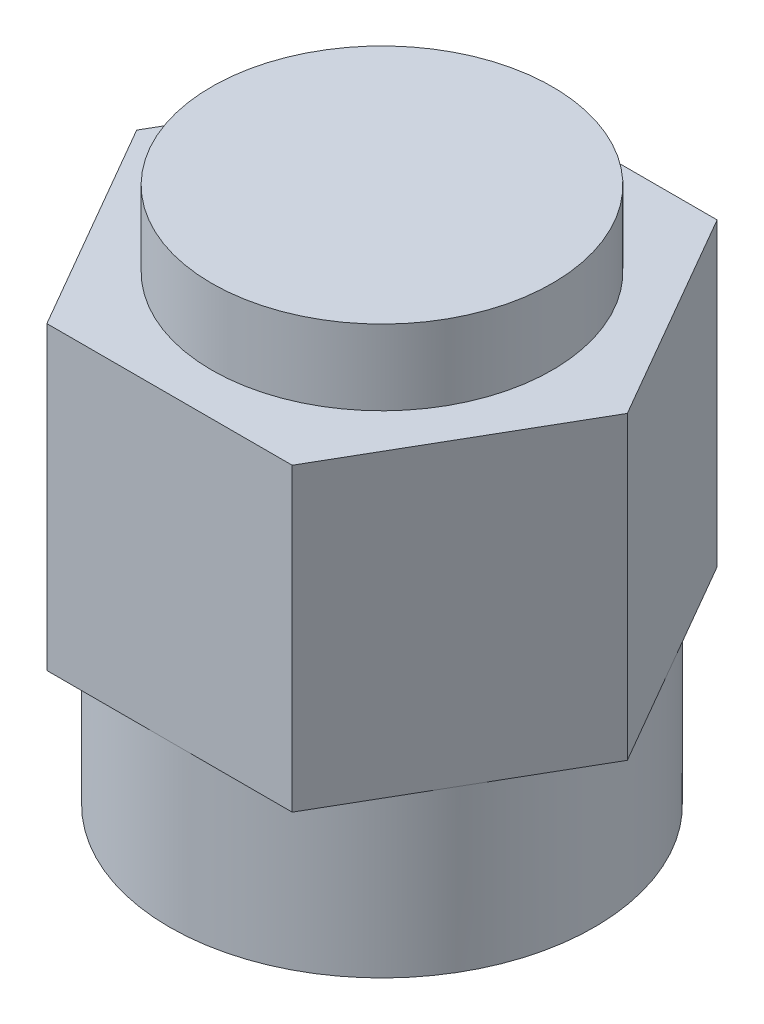
ISO-10303-21;
HEADER;
FILE_DESCRIPTION(('STEP AP214'),'2;1');
FILE_NAME('part.step','',(''),(''),'','','');
FILE_SCHEMA(('AUTOMOTIVE_DESIGN { 1 0 10303 214 1 1 1 1 }'));
ENDSEC;
DATA;
#1=APPLICATION_CONTEXT('core data for automotive mechanical design processes');
#2=APPLICATION_PROTOCOL_DEFINITION('international standard','automotive_design',2000,#1);
#3=PRODUCT_CONTEXT('',#1,'mechanical');
#4=PRODUCT('Part','Part','',(#3));
#5=PRODUCT_RELATED_PRODUCT_CATEGORY('part','',(#4));
#6=PRODUCT_DEFINITION_FORMATION('','',#4);
#7=PRODUCT_DEFINITION_CONTEXT('part definition',#1,'design');
#8=PRODUCT_DEFINITION('design','',#6,#7);
#9=PRODUCT_DEFINITION_SHAPE('','',#8);
#10=(LENGTH_UNIT() NAMED_UNIT(*) SI_UNIT(.MILLI.,.METRE.));
#11=(NAMED_UNIT(*) PLANE_ANGLE_UNIT() SI_UNIT($,.RADIAN.));
#12=(NAMED_UNIT(*) SI_UNIT($,.STERADIAN.) SOLID_ANGLE_UNIT());
#13=UNCERTAINTY_MEASURE_WITH_UNIT(LENGTH_MEASURE(1.E-05),#10,'distance_accuracy_value','');
#14=(GEOMETRIC_REPRESENTATION_CONTEXT(3) GLOBAL_UNCERTAINTY_ASSIGNED_CONTEXT((#13)) GLOBAL_UNIT_ASSIGNED_CONTEXT((#10,
#11,#12)) REPRESENTATION_CONTEXT('',''));
#15=CARTESIAN_POINT('',(0.,0.,0.));
#16=DIRECTION('',(0.,0.,1.));
#17=DIRECTION('',(1.,0.,0.));
#18=AXIS2_PLACEMENT_3D('',#15,#16,#17);
#19=CARTESIAN_POINT('',(0.,3.,0.));
#20=DIRECTION('',(0.,-1.,0.));
#21=DIRECTION('',(0.,0.,-1.));
#22=AXIS2_PLACEMENT_3D('',#19,#20,#21);
#23=CYLINDRICAL_SURFACE('',#22,3.96);
#24=CARTESIAN_POINT('',(0.,3.,0.));
#25=DIRECTION('',(0.,1.,0.));
#26=DIRECTION('',(0.,0.,1.));
#27=AXIS2_PLACEMENT_3D('',#24,#25,#26);
#28=CIRCLE('',#27,3.96);
#29=CARTESIAN_POINT('',(0.,3.,3.96));
#30=VERTEX_POINT('',#29);
#31=CARTESIAN_POINT('',(3.42946059898638,3.,1.98));
#32=VERTEX_POINT('',#31);
#33=EDGE_CURVE('E46',#30,#32,#28,.T.);
#34=ORIENTED_EDGE('',*,*,#33,.F.);
#35=CARTESIAN_POINT('',(-3.42946059898638,3.,1.98));
#36=VERTEX_POINT('',#35);
#37=EDGE_CURVE('E54',#36,#30,#28,.T.);
#38=ORIENTED_EDGE('',*,*,#37,.F.);
#39=CARTESIAN_POINT('',(-3.42946059898638,3.,-1.98));
#40=VERTEX_POINT('',#39);
#41=EDGE_CURVE('E58',#40,#36,#28,.T.);
#42=ORIENTED_EDGE('',*,*,#41,.F.);
#43=CARTESIAN_POINT('',(0.,3.,-3.96));
#44=VERTEX_POINT('',#43);
#45=EDGE_CURVE('E172',#44,#40,#28,.T.);
#46=ORIENTED_EDGE('',*,*,#45,.F.);
#47=CARTESIAN_POINT('',(3.42946059898638,3.,-1.98));
#48=VERTEX_POINT('',#47);
#49=EDGE_CURVE('E168',#48,#44,#28,.T.);
#50=ORIENTED_EDGE('',*,*,#49,.F.);
#51=EDGE_CURVE('E164',#32,#48,#28,.T.);
#52=ORIENTED_EDGE('',*,*,#51,.F.);
#53=EDGE_LOOP('',(#34,#38,#42,#46,#50,#52));
#54=FACE_BOUND('',#53,.T.);
#55=CARTESIAN_POINT('',(0.,0.,0.));
#56=DIRECTION('',(0.,1.,0.));
#57=DIRECTION('',(0.,0.,1.));
#58=AXIS2_PLACEMENT_3D('',#55,#56,#57);
#59=CIRCLE('',#58,3.96);
#60=CARTESIAN_POINT('',(0.,0.,3.96));
#61=VERTEX_POINT('',#60);
#62=EDGE_CURVE('E41',#61,#61,#59,.T.);
#63=ORIENTED_EDGE('',*,*,#62,.T.);
#64=EDGE_LOOP('',(#63));
#65=FACE_BOUND('',#64,.T.);
#66=ADVANCED_FACE('F38',(#54,#65),#23,.T.);
#67=CARTESIAN_POINT('',(0.,0.,0.));
#68=DIRECTION('',(0.,1.,0.));
#69=DIRECTION('',(0.,0.,1.));
#70=AXIS2_PLACEMENT_3D('',#67,#68,#69);
#71=PLANE('',#70);
#72=CARTESIAN_POINT('',(0.,0.,0.));
#73=DIRECTION('',(0.,-1.,0.));
#74=DIRECTION('',(0.,0.,-1.));
#75=AXIS2_PLACEMENT_3D('',#72,#73,#74);
#76=CIRCLE('',#75,3.175);
#77=CARTESIAN_POINT('',(0.,0.,-3.175));
#78=VERTEX_POINT('',#77);
#79=EDGE_CURVE('E237',#78,#78,#76,.T.);
#80=ORIENTED_EDGE('',*,*,#79,.F.);
#81=EDGE_LOOP('',(#80));
#82=FACE_BOUND('',#81,.T.);
#83=ORIENTED_EDGE('',*,*,#62,.F.);
#84=EDGE_LOOP('',(#83));
#85=FACE_BOUND('',#84,.T.);
#86=ADVANCED_FACE('F177',(#82,#85),#71,.F.);
#87=CARTESIAN_POINT('',(0.,3.,0.));
#88=DIRECTION('',(0.,-1.,0.));
#89=DIRECTION('',(0.,0.,-1.));
#90=AXIS2_PLACEMENT_3D('',#87,#88,#89);
#91=PLANE('',#90);
#92=DIRECTION('',(-1.,0.,0.));
#93=VECTOR('',#92,1.);
#94=CARTESIAN_POINT('',(2.28630706599092,3.,3.96));
#95=LINE('',#94,#93);
#96=CARTESIAN_POINT('',(2.28630706599092,3.,3.96));
#97=VERTEX_POINT('',#96);
#98=EDGE_CURVE('E135',#97,#30,#95,.T.);
#99=ORIENTED_EDGE('',*,*,#98,.T.);
#100=ORIENTED_EDGE('',*,*,#33,.T.);
#101=DIRECTION('',(-0.5,0.,0.866025403784439));
#102=VECTOR('',#101,1.);
#103=CARTESIAN_POINT('',(4.57261413198183,3.,0.));
#104=LINE('',#103,#102);
#105=EDGE_CURVE('E249',#32,#97,#104,.T.);
#106=ORIENTED_EDGE('',*,*,#105,.T.);
#107=EDGE_LOOP('',(#99,#100,#106));
#108=FACE_BOUND('',#107,.T.);
#109=ADVANCED_FACE('F179',(#108),#91,.T.);
#110=CARTESIAN_POINT('',(4.57261413198183,3.,0.));
#111=VERTEX_POINT('',#110);
#112=EDGE_CURVE('E246',#111,#32,#104,.T.);
#113=ORIENTED_EDGE('',*,*,#112,.T.);
#114=ORIENTED_EDGE('',*,*,#51,.T.);
#115=DIRECTION('',(0.5,0.,0.866025403784439));
#116=VECTOR('',#115,1.);
#117=CARTESIAN_POINT('',(2.28630706599092,3.,-3.96));
#118=LINE('',#117,#116);
#119=EDGE_CURVE('E253',#48,#111,#118,.T.);
#120=ORIENTED_EDGE('',*,*,#119,.T.);
#121=EDGE_LOOP('',(#113,#114,#120));
#122=FACE_BOUND('',#121,.T.);
#123=ADVANCED_FACE('F185',(#122),#91,.T.);
#124=CARTESIAN_POINT('',(2.28630706599092,3.,-3.96));
#125=VERTEX_POINT('',#124);
#126=EDGE_CURVE('E250',#125,#48,#118,.T.);
#127=ORIENTED_EDGE('',*,*,#126,.T.);
#128=ORIENTED_EDGE('',*,*,#49,.T.);
#129=DIRECTION('',(1.,0.,0.));
#130=VECTOR('',#129,1.);
#131=CARTESIAN_POINT('',(-2.28630706599092,3.,-3.96));
#132=LINE('',#131,#130);
#133=EDGE_CURVE('E254',#44,#125,#132,.T.);
#134=ORIENTED_EDGE('',*,*,#133,.T.);
#135=EDGE_LOOP('',(#127,#128,#134));
#136=FACE_BOUND('',#135,.T.);
#137=ADVANCED_FACE('F272',(#136),#91,.T.);
#138=CARTESIAN_POINT('',(-2.28630706599092,3.,-3.96));
#139=VERTEX_POINT('',#138);
#140=EDGE_CURVE('E126',#139,#44,#132,.T.);
#141=ORIENTED_EDGE('',*,*,#140,.T.);
#142=ORIENTED_EDGE('',*,*,#45,.T.);
#143=DIRECTION('',(0.5,0.,-0.866025403784439));
#144=VECTOR('',#143,1.);
#145=CARTESIAN_POINT('',(-4.57261413198184,3.,0.));
#146=LINE('',#145,#144);
#147=EDGE_CURVE('E257',#40,#139,#146,.T.);
#148=ORIENTED_EDGE('',*,*,#147,.T.);
#149=EDGE_LOOP('',(#141,#142,#148));
#150=FACE_BOUND('',#149,.T.);
#151=ADVANCED_FACE('F271',(#150),#91,.T.);
#152=CARTESIAN_POINT('',(-4.57261413198184,3.,0.));
#153=VERTEX_POINT('',#152);
#154=EDGE_CURVE('E255',#153,#40,#146,.T.);
#155=ORIENTED_EDGE('',*,*,#154,.T.);
#156=ORIENTED_EDGE('',*,*,#41,.T.);
#157=DIRECTION('',(-0.5,0.,-0.866025403784439));
#158=VECTOR('',#157,1.);
#159=CARTESIAN_POINT('',(-2.28630706599092,3.,3.96));
#160=LINE('',#159,#158);
#161=EDGE_CURVE('E244',#36,#153,#160,.T.);
#162=ORIENTED_EDGE('',*,*,#161,.T.);
#163=EDGE_LOOP('',(#155,#156,#162));
#164=FACE_BOUND('',#163,.T.);
#165=ADVANCED_FACE('F192',(#164),#91,.T.);
#166=CARTESIAN_POINT('',(0.,8.6,0.));
#167=DIRECTION('',(0.,1.,0.));
#168=DIRECTION('',(0.,0.,1.));
#169=AXIS2_PLACEMENT_3D('',#166,#167,#168);
#170=PLANE('',#169);
#171=CARTESIAN_POINT('',(0.,8.6,0.));
#172=DIRECTION('',(0.,1.,0.));
#173=DIRECTION('',(0.,0.,1.));
#174=AXIS2_PLACEMENT_3D('',#171,#172,#173);
#175=CIRCLE('',#174,3.175);
#176=CARTESIAN_POINT('',(0.,8.6,3.175));
#177=VERTEX_POINT('',#176);
#178=EDGE_CURVE('E12',#177,#177,#175,.T.);
#179=ORIENTED_EDGE('',*,*,#178,.F.);
#180=EDGE_LOOP('',(#179));
#181=FACE_BOUND('',#180,.T.);
#182=DIRECTION('',(-0.5,0.,-0.866025403784439));
#183=VECTOR('',#182,1.);
#184=CARTESIAN_POINT('',(-2.28630706599092,8.6,3.96));
#185=LINE('',#184,#183);
#186=CARTESIAN_POINT('',(-2.28630706599092,8.6,3.96));
#187=VERTEX_POINT('',#186);
#188=CARTESIAN_POINT('',(-4.57261413198184,8.6,0.));
#189=VERTEX_POINT('',#188);
#190=EDGE_CURVE('E144',#187,#189,#185,.T.);
#191=ORIENTED_EDGE('',*,*,#190,.F.);
#192=DIRECTION('',(-1.,0.,0.));
#193=VECTOR('',#192,1.);
#194=CARTESIAN_POINT('',(2.28630706599092,8.6,3.96));
#195=LINE('',#194,#193);
#196=CARTESIAN_POINT('',(2.28630706599092,8.6,3.96));
#197=VERTEX_POINT('',#196);
#198=EDGE_CURVE('E147',#197,#187,#195,.T.);
#199=ORIENTED_EDGE('',*,*,#198,.F.);
#200=DIRECTION('',(-0.5,0.,0.866025403784439));
#201=VECTOR('',#200,1.);
#202=CARTESIAN_POINT('',(4.57261413198183,8.6,0.));
#203=LINE('',#202,#201);
#204=CARTESIAN_POINT('',(4.57261413198183,8.6,0.));
#205=VERTEX_POINT('',#204);
#206=EDGE_CURVE('E151',#205,#197,#203,.T.);
#207=ORIENTED_EDGE('',*,*,#206,.F.);
#208=DIRECTION('',(0.5,0.,0.866025403784439));
#209=VECTOR('',#208,1.);
#210=CARTESIAN_POINT('',(2.28630706599092,8.6,-3.96));
#211=LINE('',#210,#209);
#212=CARTESIAN_POINT('',(2.28630706599092,8.6,-3.96));
#213=VERTEX_POINT('',#212);
#214=EDGE_CURVE('E114',#213,#205,#211,.T.);
#215=ORIENTED_EDGE('',*,*,#214,.F.);
#216=DIRECTION('',(1.,0.,0.));
#217=VECTOR('',#216,1.);
#218=CARTESIAN_POINT('',(-2.28630706599092,8.6,-3.96));
#219=LINE('',#218,#217);
#220=CARTESIAN_POINT('',(-2.28630706599092,8.6,-3.96));
#221=VERTEX_POINT('',#220);
#222=EDGE_CURVE('E107',#221,#213,#219,.T.);
#223=ORIENTED_EDGE('',*,*,#222,.F.);
#224=DIRECTION('',(0.5,0.,-0.866025403784439));
#225=VECTOR('',#224,1.);
#226=CARTESIAN_POINT('',(-4.57261413198184,8.6,0.));
#227=LINE('',#226,#225);
#228=EDGE_CURVE('E111',#189,#221,#227,.T.);
#229=ORIENTED_EDGE('',*,*,#228,.F.);
#230=EDGE_LOOP('',(#191,#199,#207,#215,#223,#229));
#231=FACE_BOUND('',#230,.T.);
#232=ADVANCED_FACE('F109',(#181,#231),#170,.T.);
#233=CARTESIAN_POINT('',(-2.28630706599092,3.,3.96));
#234=VERTEX_POINT('',#233);
#235=EDGE_CURVE('E142',#234,#36,#160,.T.);
#236=ORIENTED_EDGE('',*,*,#235,.T.);
#237=ORIENTED_EDGE('',*,*,#37,.T.);
#238=EDGE_CURVE('E138',#30,#234,#95,.T.);
#239=ORIENTED_EDGE('',*,*,#238,.T.);
#240=EDGE_LOOP('',(#236,#237,#239));
#241=FACE_BOUND('',#240,.T.);
#242=ADVANCED_FACE('F187',(#241),#91,.T.);
#243=CARTESIAN_POINT('',(-4.57261413198184,29.2979998346834,0.));
#244=DIRECTION('',(-0.866025403784439,0.,-0.5));
#245=DIRECTION('',(-0.5,0.,0.866025403784439));
#246=AXIS2_PLACEMENT_3D('',#243,#244,#245);
#247=PLANE('',#246);
#248=DIRECTION('',(0.,-1.,0.));
#249=VECTOR('',#248,1.);
#250=CARTESIAN_POINT('',(-4.57261413198184,29.2979998346834,0.));
#251=LINE('',#250,#249);
#252=EDGE_CURVE('E134',#189,#153,#251,.T.);
#253=ORIENTED_EDGE('',*,*,#252,.F.);
#254=ORIENTED_EDGE('',*,*,#228,.T.);
#255=DIRECTION('',(0.,-1.,0.));
#256=VECTOR('',#255,1.);
#257=CARTESIAN_POINT('',(-2.28630706599092,29.2979998346834,-3.96));
#258=LINE('',#257,#256);
#259=EDGE_CURVE('E119',#221,#139,#258,.T.);
#260=ORIENTED_EDGE('',*,*,#259,.T.);
#261=ORIENTED_EDGE('',*,*,#147,.F.);
#262=ORIENTED_EDGE('',*,*,#154,.F.);
#263=EDGE_LOOP('',(#253,#254,#260,#261,#262));
#264=FACE_BOUND('',#263,.T.);
#265=ADVANCED_FACE('F131',(#264),#247,.T.);
#266=CARTESIAN_POINT('',(-2.28630706599092,29.2979998346834,-3.96));
#267=DIRECTION('',(0.,0.,-1.));
#268=DIRECTION('',(-1.,0.,0.));
#269=AXIS2_PLACEMENT_3D('',#266,#267,#268);
#270=PLANE('',#269);
#271=ORIENTED_EDGE('',*,*,#259,.F.);
#272=ORIENTED_EDGE('',*,*,#222,.T.);
#273=DIRECTION('',(0.,-1.,0.));
#274=VECTOR('',#273,1.);
#275=CARTESIAN_POINT('',(2.28630706599092,29.2979998346834,-3.96));
#276=LINE('',#275,#274);
#277=EDGE_CURVE('E118',#213,#125,#276,.T.);
#278=ORIENTED_EDGE('',*,*,#277,.T.);
#279=ORIENTED_EDGE('',*,*,#133,.F.);
#280=ORIENTED_EDGE('',*,*,#140,.F.);
#281=EDGE_LOOP('',(#271,#272,#278,#279,#280));
#282=FACE_BOUND('',#281,.T.);
#283=ADVANCED_FACE('F123',(#282),#270,.T.);
#284=CARTESIAN_POINT('',(2.28630706599092,29.2979998346834,-3.96));
#285=DIRECTION('',(0.866025403784439,0.,-0.5));
#286=DIRECTION('',(-0.5,0.,-0.866025403784439));
#287=AXIS2_PLACEMENT_3D('',#284,#285,#286);
#288=PLANE('',#287);
#289=ORIENTED_EDGE('',*,*,#277,.F.);
#290=ORIENTED_EDGE('',*,*,#214,.T.);
#291=DIRECTION('',(0.,-1.,0.));
#292=VECTOR('',#291,1.);
#293=CARTESIAN_POINT('',(4.57261413198183,29.2979998346834,0.));
#294=LINE('',#293,#292);
#295=EDGE_CURVE('E154',#205,#111,#294,.T.);
#296=ORIENTED_EDGE('',*,*,#295,.T.);
#297=ORIENTED_EDGE('',*,*,#119,.F.);
#298=ORIENTED_EDGE('',*,*,#126,.F.);
#299=EDGE_LOOP('',(#289,#290,#296,#297,#298));
#300=FACE_BOUND('',#299,.T.);
#301=ADVANCED_FACE('F198',(#300),#288,.T.);
#302=CARTESIAN_POINT('',(4.57261413198183,29.2979998346834,0.));
#303=DIRECTION('',(0.866025403784439,0.,0.5));
#304=DIRECTION('',(0.5,0.,-0.866025403784439));
#305=AXIS2_PLACEMENT_3D('',#302,#303,#304);
#306=PLANE('',#305);
#307=ORIENTED_EDGE('',*,*,#295,.F.);
#308=ORIENTED_EDGE('',*,*,#206,.T.);
#309=DIRECTION('',(0.,-1.,0.));
#310=VECTOR('',#309,1.);
#311=CARTESIAN_POINT('',(2.28630706599092,29.2979998346834,3.96));
#312=LINE('',#311,#310);
#313=EDGE_CURVE('E150',#197,#97,#312,.T.);
#314=ORIENTED_EDGE('',*,*,#313,.T.);
#315=ORIENTED_EDGE('',*,*,#105,.F.);
#316=ORIENTED_EDGE('',*,*,#112,.F.);
#317=EDGE_LOOP('',(#307,#308,#314,#315,#316));
#318=FACE_BOUND('',#317,.T.);
#319=ADVANCED_FACE('F201',(#318),#306,.T.);
#320=CARTESIAN_POINT('',(2.28630706599092,29.2979998346834,3.96));
#321=DIRECTION('',(0.,0.,1.));
#322=DIRECTION('',(1.,0.,0.));
#323=AXIS2_PLACEMENT_3D('',#320,#321,#322);
#324=PLANE('',#323);
#325=ORIENTED_EDGE('',*,*,#313,.F.);
#326=ORIENTED_EDGE('',*,*,#198,.T.);
#327=DIRECTION('',(0.,-1.,0.));
#328=VECTOR('',#327,1.);
#329=CARTESIAN_POINT('',(-2.28630706599092,29.2979998346834,3.96));
#330=LINE('',#329,#328);
#331=EDGE_CURVE('E146',#187,#234,#330,.T.);
#332=ORIENTED_EDGE('',*,*,#331,.T.);
#333=ORIENTED_EDGE('',*,*,#238,.F.);
#334=ORIENTED_EDGE('',*,*,#98,.F.);
#335=EDGE_LOOP('',(#325,#326,#332,#333,#334));
#336=FACE_BOUND('',#335,.T.);
#337=ADVANCED_FACE('F205',(#336),#324,.T.);
#338=CARTESIAN_POINT('',(-2.28630706599092,29.2979998346834,3.96));
#339=DIRECTION('',(-0.866025403784439,0.,0.5));
#340=DIRECTION('',(0.5,0.,0.866025403784439));
#341=AXIS2_PLACEMENT_3D('',#338,#339,#340);
#342=PLANE('',#341);
#343=ORIENTED_EDGE('',*,*,#331,.F.);
#344=ORIENTED_EDGE('',*,*,#190,.T.);
#345=ORIENTED_EDGE('',*,*,#252,.T.);
#346=ORIENTED_EDGE('',*,*,#161,.F.);
#347=ORIENTED_EDGE('',*,*,#235,.F.);
#348=EDGE_LOOP('',(#343,#344,#345,#346,#347));
#349=FACE_BOUND('',#348,.T.);
#350=ADVANCED_FACE('F209',(#349),#342,.T.);
#351=CARTESIAN_POINT('',(0.,5.,0.));
#352=DIRECTION('',(0.,-1.,0.));
#353=DIRECTION('',(0.,0.,-1.));
#354=AXIS2_PLACEMENT_3D('',#351,#352,#353);
#355=CYLINDRICAL_SURFACE('',#354,3.175);
#356=CARTESIAN_POINT('',(0.,5.,0.));
#357=DIRECTION('',(0.,-1.,0.));
#358=DIRECTION('',(0.,0.,-1.));
#359=AXIS2_PLACEMENT_3D('',#356,#357,#358);
#360=CIRCLE('',#359,3.175);
#361=CARTESIAN_POINT('',(0.,5.,-3.175));
#362=VERTEX_POINT('',#361);
#363=EDGE_CURVE('E240',#362,#362,#360,.T.);
#364=ORIENTED_EDGE('',*,*,#363,.F.);
#365=EDGE_LOOP('',(#364));
#366=FACE_BOUND('',#365,.T.);
#367=ORIENTED_EDGE('',*,*,#79,.T.);
#368=EDGE_LOOP('',(#367));
#369=FACE_BOUND('',#368,.T.);
#370=ADVANCED_FACE('F212',(#366,#369),#355,.F.);
#371=CARTESIAN_POINT('',(0.,5.,0.));
#372=DIRECTION('',(0.,-1.,0.));
#373=DIRECTION('',(0.,0.,-1.));
#374=AXIS2_PLACEMENT_3D('',#371,#372,#373);
#375=PLANE('',#374);
#376=ORIENTED_EDGE('',*,*,#363,.T.);
#377=EDGE_LOOP('',(#376));
#378=FACE_BOUND('',#377,.T.);
#379=ADVANCED_FACE('F218',(#378),#375,.T.);
#380=CARTESIAN_POINT('',(0.,28.9802561210692,0.));
#381=DIRECTION('',(0.,-1.,0.));
#382=DIRECTION('',(0.,0.,-1.));
#383=AXIS2_PLACEMENT_3D('',#380,#381,#382);
#384=CYLINDRICAL_SURFACE('',#383,3.175);
#385=ORIENTED_EDGE('',*,*,#178,.T.);
#386=EDGE_LOOP('',(#385));
#387=FACE_BOUND('',#386,.T.);
#388=CARTESIAN_POINT('',(0.,10.,0.));
#389=DIRECTION('',(0.,1.,0.));
#390=DIRECTION('',(0.,0.,1.));
#391=AXIS2_PLACEMENT_3D('',#388,#389,#390);
#392=CIRCLE('',#391,3.175);
#393=CARTESIAN_POINT('',(0.,10.,3.175));
#394=VERTEX_POINT('',#393);
#395=EDGE_CURVE('E236',#394,#394,#392,.T.);
#396=ORIENTED_EDGE('',*,*,#395,.F.);
#397=EDGE_LOOP('',(#396));
#398=FACE_BOUND('',#397,.T.);
#399=ADVANCED_FACE('F222',(#387,#398),#384,.T.);
#400=CARTESIAN_POINT('',(0.,10.,0.));
#401=DIRECTION('',(0.,1.,0.));
#402=DIRECTION('',(0.,0.,1.));
#403=AXIS2_PLACEMENT_3D('',#400,#401,#402);
#404=PLANE('',#403);
#405=ORIENTED_EDGE('',*,*,#395,.T.);
#406=EDGE_LOOP('',(#405));
#407=FACE_BOUND('',#406,.T.);
#408=ADVANCED_FACE('F224',(#407),#404,.T.);
#409=CLOSED_SHELL('',(#66,#86,#109,#123,#137,#151,#165,#232,#242,#265,#283,#301,#319,#337,#350,
#370,#379,#399,#408));
#410=MANIFOLD_SOLID_BREP('B2',#409);
#411=ADVANCED_BREP_SHAPE_REPRESENTATION('',(#18,#410),#14);
#412=SHAPE_DEFINITION_REPRESENTATION(#9,#411);
ENDSEC;
END-ISO-10303-21;
